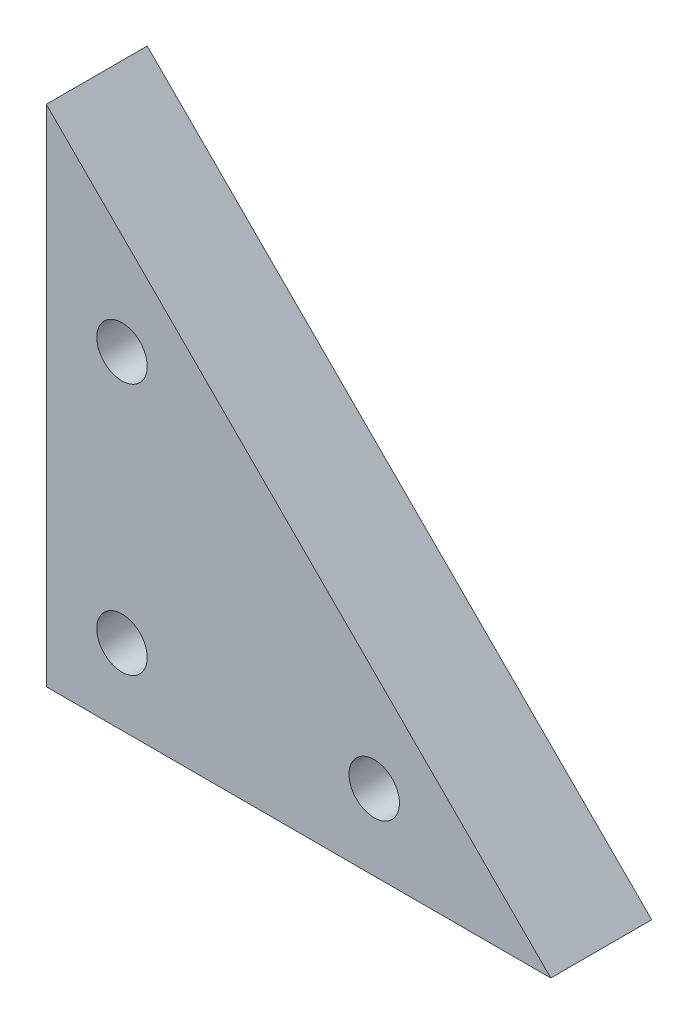
ISO-10303-21;
HEADER;
FILE_DESCRIPTION(('STEP AP214'),'2;1');
FILE_NAME('part.step','',(''),(''),'','','');
FILE_SCHEMA(('AUTOMOTIVE_DESIGN { 1 0 10303 214 1 1 1 1 }'));
ENDSEC;
DATA;
#1=APPLICATION_CONTEXT('core data for automotive mechanical design processes');
#2=APPLICATION_PROTOCOL_DEFINITION('international standard','automotive_design',2000,#1);
#3=PRODUCT_CONTEXT('',#1,'mechanical');
#4=PRODUCT('Part','Part','',(#3));
#5=PRODUCT_RELATED_PRODUCT_CATEGORY('part','',(#4));
#6=PRODUCT_DEFINITION_FORMATION('','',#4);
#7=PRODUCT_DEFINITION_CONTEXT('part definition',#1,'design');
#8=PRODUCT_DEFINITION('design','',#6,#7);
#9=PRODUCT_DEFINITION_SHAPE('','',#8);
#10=(LENGTH_UNIT() NAMED_UNIT(*) SI_UNIT(.MILLI.,.METRE.));
#11=(NAMED_UNIT(*) PLANE_ANGLE_UNIT() SI_UNIT($,.RADIAN.));
#12=(NAMED_UNIT(*) SI_UNIT($,.STERADIAN.) SOLID_ANGLE_UNIT());
#13=UNCERTAINTY_MEASURE_WITH_UNIT(LENGTH_MEASURE(1.E-05),#10,'distance_accuracy_value','');
#14=(GEOMETRIC_REPRESENTATION_CONTEXT(3) GLOBAL_UNCERTAINTY_ASSIGNED_CONTEXT((#13)) GLOBAL_UNIT_ASSIGNED_CONTEXT((#10,
#11,#12)) REPRESENTATION_CONTEXT('',''));
#15=CARTESIAN_POINT('',(0.,0.,0.));
#16=DIRECTION('',(0.,0.,1.));
#17=DIRECTION('',(1.,0.,0.));
#18=AXIS2_PLACEMENT_3D('',#15,#16,#17);
#19=CARTESIAN_POINT('',(0.,100.,20.));
#20=DIRECTION('',(1.,0.,0.));
#21=DIRECTION('',(0.,1.,0.));
#22=AXIS2_PLACEMENT_3D('',#19,#20,#21);
#23=PLANE('',#22);
#24=DIRECTION('',(0.,-1.,0.));
#25=VECTOR('',#24,1.);
#26=CARTESIAN_POINT('',(0.,100.,0.));
#27=LINE('',#26,#25);
#28=CARTESIAN_POINT('',(0.,100.,0.));
#29=VERTEX_POINT('',#28);
#30=CARTESIAN_POINT('',(0.,0.,0.));
#31=VERTEX_POINT('',#30);
#32=EDGE_CURVE('E91',#29,#31,#27,.T.);
#33=ORIENTED_EDGE('',*,*,#32,.T.);
#34=DIRECTION('',(0.,0.,-1.));
#35=VECTOR('',#34,1.);
#36=CARTESIAN_POINT('',(0.,0.,20.));
#37=LINE('',#36,#35);
#38=CARTESIAN_POINT('',(0.,0.,20.));
#39=VERTEX_POINT('',#38);
#40=EDGE_CURVE('E12',#39,#31,#37,.T.);
#41=ORIENTED_EDGE('',*,*,#40,.F.);
#42=DIRECTION('',(0.,-1.,0.));
#43=VECTOR('',#42,1.);
#44=CARTESIAN_POINT('',(0.,100.,20.));
#45=LINE('',#44,#43);
#46=CARTESIAN_POINT('',(0.,100.,20.));
#47=VERTEX_POINT('',#46);
#48=EDGE_CURVE('E85',#47,#39,#45,.T.);
#49=ORIENTED_EDGE('',*,*,#48,.F.);
#50=DIRECTION('',(0.,0.,-1.));
#51=VECTOR('',#50,1.);
#52=CARTESIAN_POINT('',(0.,100.,20.));
#53=LINE('',#52,#51);
#54=EDGE_CURVE('E92',#47,#29,#53,.T.);
#55=ORIENTED_EDGE('',*,*,#54,.T.);
#56=EDGE_LOOP('',(#33,#41,#49,#55));
#57=FACE_BOUND('',#56,.T.);
#58=ADVANCED_FACE('F45',(#57),#23,.F.);
#59=CARTESIAN_POINT('',(0.,0.,20.));
#60=DIRECTION('',(0.,1.,0.));
#61=DIRECTION('',(0.,0.,1.));
#62=AXIS2_PLACEMENT_3D('',#59,#60,#61);
#63=PLANE('',#62);
#64=DIRECTION('',(1.,0.,0.));
#65=VECTOR('',#64,1.);
#66=CARTESIAN_POINT('',(0.,0.,0.));
#67=LINE('',#66,#65);
#68=CARTESIAN_POINT('',(100.,0.,0.));
#69=VERTEX_POINT('',#68);
#70=EDGE_CURVE('E73',#31,#69,#67,.T.);
#71=ORIENTED_EDGE('',*,*,#70,.T.);
#72=DIRECTION('',(0.,0.,-1.));
#73=VECTOR('',#72,1.);
#74=CARTESIAN_POINT('',(100.,0.,20.));
#75=LINE('',#74,#73);
#76=CARTESIAN_POINT('',(100.,0.,20.));
#77=VERTEX_POINT('',#76);
#78=EDGE_CURVE('E53',#77,#69,#75,.T.);
#79=ORIENTED_EDGE('',*,*,#78,.F.);
#80=DIRECTION('',(1.,0.,0.));
#81=VECTOR('',#80,1.);
#82=CARTESIAN_POINT('',(0.,0.,20.));
#83=LINE('',#82,#81);
#84=EDGE_CURVE('E81',#39,#77,#83,.T.);
#85=ORIENTED_EDGE('',*,*,#84,.F.);
#86=ORIENTED_EDGE('',*,*,#40,.T.);
#87=EDGE_LOOP('',(#71,#79,#85,#86));
#88=FACE_BOUND('',#87,.T.);
#89=ADVANCED_FACE('F82',(#88),#63,.F.);
#90=CARTESIAN_POINT('',(100.,0.,20.));
#91=DIRECTION('',(-0.707106781186548,-0.707106781186548,0.));
#92=DIRECTION('',(0.707106781186548,-0.707106781186548,0.));
#93=AXIS2_PLACEMENT_3D('',#90,#91,#92);
#94=PLANE('',#93);
#95=DIRECTION('',(-0.707106781186547,0.707106781186547,0.));
#96=VECTOR('',#95,1.);
#97=CARTESIAN_POINT('',(100.,0.,0.));
#98=LINE('',#97,#96);
#99=EDGE_CURVE('E78',#69,#29,#98,.T.);
#100=ORIENTED_EDGE('',*,*,#99,.T.);
#101=ORIENTED_EDGE('',*,*,#54,.F.);
#102=DIRECTION('',(-0.707106781186547,0.707106781186547,0.));
#103=VECTOR('',#102,1.);
#104=CARTESIAN_POINT('',(100.,0.,20.));
#105=LINE('',#104,#103);
#106=EDGE_CURVE('E61',#77,#47,#105,.T.);
#107=ORIENTED_EDGE('',*,*,#106,.F.);
#108=ORIENTED_EDGE('',*,*,#78,.T.);
#109=EDGE_LOOP('',(#100,#101,#107,#108));
#110=FACE_BOUND('',#109,.T.);
#111=ADVANCED_FACE('F103',(#110),#94,.F.);
#112=CARTESIAN_POINT('',(0.,0.,20.));
#113=DIRECTION('',(0.,0.,1.));
#114=DIRECTION('',(1.,0.,0.));
#115=AXIS2_PLACEMENT_3D('',#112,#113,#114);
#116=PLANE('',#115);
#117=CARTESIAN_POINT('',(65.,15.,20.));
#118=DIRECTION('',(0.,0.,1.));
#119=DIRECTION('',(1.,0.,0.));
#120=AXIS2_PLACEMENT_3D('',#117,#118,#119);
#121=CIRCLE('',#120,5.00000000000002);
#122=CARTESIAN_POINT('',(70.,15.,20.));
#123=VERTEX_POINT('',#122);
#124=EDGE_CURVE('E198',#123,#123,#121,.T.);
#125=ORIENTED_EDGE('',*,*,#124,.F.);
#126=EDGE_LOOP('',(#125));
#127=FACE_BOUND('',#126,.T.);
#128=CARTESIAN_POINT('',(15.,15.,20.));
#129=DIRECTION('',(0.,0.,1.));
#130=DIRECTION('',(1.,0.,0.));
#131=AXIS2_PLACEMENT_3D('',#128,#129,#130);
#132=CIRCLE('',#131,5.);
#133=CARTESIAN_POINT('',(20.,15.,20.));
#134=VERTEX_POINT('',#133);
#135=EDGE_CURVE('E200',#134,#134,#132,.T.);
#136=ORIENTED_EDGE('',*,*,#135,.F.);
#137=EDGE_LOOP('',(#136));
#138=FACE_BOUND('',#137,.T.);
#139=CARTESIAN_POINT('',(15.,65.,20.));
#140=DIRECTION('',(0.,0.,1.));
#141=DIRECTION('',(1.,0.,0.));
#142=AXIS2_PLACEMENT_3D('',#139,#140,#141);
#143=CIRCLE('',#142,5.00000000000001);
#144=CARTESIAN_POINT('',(20.,65.,20.));
#145=VERTEX_POINT('',#144);
#146=EDGE_CURVE('E98',#145,#145,#143,.T.);
#147=ORIENTED_EDGE('',*,*,#146,.F.);
#148=EDGE_LOOP('',(#147));
#149=FACE_BOUND('',#148,.T.);
#150=ORIENTED_EDGE('',*,*,#48,.T.);
#151=ORIENTED_EDGE('',*,*,#84,.T.);
#152=ORIENTED_EDGE('',*,*,#106,.T.);
#153=EDGE_LOOP('',(#150,#151,#152));
#154=FACE_BOUND('',#153,.T.);
#155=ADVANCED_FACE('F88',(#127,#138,#149,#154),#116,.T.);
#156=CARTESIAN_POINT('',(0.,0.,0.));
#157=DIRECTION('',(0.,0.,1.));
#158=DIRECTION('',(1.,0.,0.));
#159=AXIS2_PLACEMENT_3D('',#156,#157,#158);
#160=PLANE('',#159);
#161=CARTESIAN_POINT('',(65.,15.,0.));
#162=DIRECTION('',(0.,0.,1.));
#163=DIRECTION('',(1.,0.,0.));
#164=AXIS2_PLACEMENT_3D('',#161,#162,#163);
#165=CIRCLE('',#164,5.00000000000002);
#166=CARTESIAN_POINT('',(70.,15.,0.));
#167=VERTEX_POINT('',#166);
#168=EDGE_CURVE('E195',#167,#167,#165,.T.);
#169=ORIENTED_EDGE('',*,*,#168,.T.);
#170=EDGE_LOOP('',(#169));
#171=FACE_BOUND('',#170,.T.);
#172=CARTESIAN_POINT('',(15.,15.,0.));
#173=DIRECTION('',(0.,0.,1.));
#174=DIRECTION('',(1.,0.,0.));
#175=AXIS2_PLACEMENT_3D('',#172,#173,#174);
#176=CIRCLE('',#175,5.);
#177=CARTESIAN_POINT('',(20.,15.,0.));
#178=VERTEX_POINT('',#177);
#179=EDGE_CURVE('E203',#178,#178,#176,.T.);
#180=ORIENTED_EDGE('',*,*,#179,.T.);
#181=EDGE_LOOP('',(#180));
#182=FACE_BOUND('',#181,.T.);
#183=CARTESIAN_POINT('',(15.,65.,0.));
#184=DIRECTION('',(0.,0.,1.));
#185=DIRECTION('',(1.,0.,0.));
#186=AXIS2_PLACEMENT_3D('',#183,#184,#185);
#187=CIRCLE('',#186,5.00000000000001);
#188=CARTESIAN_POINT('',(20.,65.,0.));
#189=VERTEX_POINT('',#188);
#190=EDGE_CURVE('E94',#189,#189,#187,.T.);
#191=ORIENTED_EDGE('',*,*,#190,.T.);
#192=EDGE_LOOP('',(#191));
#193=FACE_BOUND('',#192,.T.);
#194=ORIENTED_EDGE('',*,*,#32,.F.);
#195=ORIENTED_EDGE('',*,*,#99,.F.);
#196=ORIENTED_EDGE('',*,*,#70,.F.);
#197=EDGE_LOOP('',(#194,#195,#196));
#198=FACE_BOUND('',#197,.T.);
#199=ADVANCED_FACE('F104',(#171,#182,#193,#198),#160,.F.);
#200=CARTESIAN_POINT('',(15.,65.,0.));
#201=DIRECTION('',(0.,0.,1.));
#202=DIRECTION('',(1.,0.,0.));
#203=AXIS2_PLACEMENT_3D('',#200,#201,#202);
#204=CYLINDRICAL_SURFACE('',#203,5.00000000000001);
#205=ORIENTED_EDGE('',*,*,#190,.F.);
#206=EDGE_LOOP('',(#205));
#207=FACE_BOUND('',#206,.T.);
#208=ORIENTED_EDGE('',*,*,#146,.T.);
#209=EDGE_LOOP('',(#208));
#210=FACE_BOUND('',#209,.T.);
#211=ADVANCED_FACE('F106',(#207,#210),#204,.F.);
#212=CARTESIAN_POINT('',(15.,15.,0.));
#213=DIRECTION('',(0.,0.,1.));
#214=DIRECTION('',(1.,0.,0.));
#215=AXIS2_PLACEMENT_3D('',#212,#213,#214);
#216=CYLINDRICAL_SURFACE('',#215,5.);
#217=ORIENTED_EDGE('',*,*,#179,.F.);
#218=EDGE_LOOP('',(#217));
#219=FACE_BOUND('',#218,.T.);
#220=ORIENTED_EDGE('',*,*,#135,.T.);
#221=EDGE_LOOP('',(#220));
#222=FACE_BOUND('',#221,.T.);
#223=ADVANCED_FACE('F113',(#219,#222),#216,.F.);
#224=CARTESIAN_POINT('',(65.,15.,0.));
#225=DIRECTION('',(0.,0.,1.));
#226=DIRECTION('',(1.,0.,0.));
#227=AXIS2_PLACEMENT_3D('',#224,#225,#226);
#228=CYLINDRICAL_SURFACE('',#227,5.00000000000002);
#229=ORIENTED_EDGE('',*,*,#168,.F.);
#230=EDGE_LOOP('',(#229));
#231=FACE_BOUND('',#230,.T.);
#232=ORIENTED_EDGE('',*,*,#124,.T.);
#233=EDGE_LOOP('',(#232));
#234=FACE_BOUND('',#233,.T.);
#235=ADVANCED_FACE('F153',(#231,#234),#228,.F.);
#236=CLOSED_SHELL('',(#58,#89,#111,#155,#199,#211,#223,#235));
#237=MANIFOLD_SOLID_BREP('B2',#236);
#238=ADVANCED_BREP_SHAPE_REPRESENTATION('',(#18,#237),#14);
#239=SHAPE_DEFINITION_REPRESENTATION(#9,#238);
ENDSEC;
END-ISO-10303-21;
